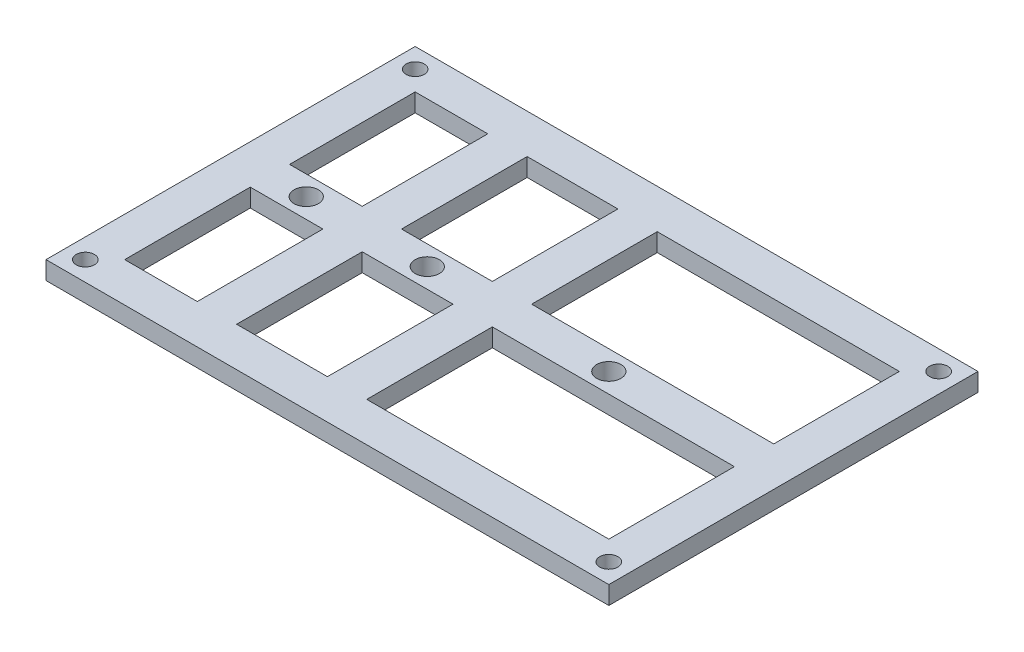
ISO-10303-21;
HEADER;
FILE_DESCRIPTION(('STEP AP214'),'2;1');
FILE_NAME('part.step','',(''),(''),'','','');
FILE_SCHEMA(('AUTOMOTIVE_DESIGN { 1 0 10303 214 1 1 1 1 }'));
ENDSEC;
DATA;
#1=APPLICATION_CONTEXT('core data for automotive mechanical design processes');
#2=APPLICATION_PROTOCOL_DEFINITION('international standard','automotive_design',2000,#1);
#3=PRODUCT_CONTEXT('',#1,'mechanical');
#4=PRODUCT('Part','Part','',(#3));
#5=PRODUCT_RELATED_PRODUCT_CATEGORY('part','',(#4));
#6=PRODUCT_DEFINITION_FORMATION('','',#4);
#7=PRODUCT_DEFINITION_CONTEXT('part definition',#1,'design');
#8=PRODUCT_DEFINITION('design','',#6,#7);
#9=PRODUCT_DEFINITION_SHAPE('','',#8);
#10=(LENGTH_UNIT() NAMED_UNIT(*) SI_UNIT(.MILLI.,.METRE.));
#11=(NAMED_UNIT(*) PLANE_ANGLE_UNIT() SI_UNIT($,.RADIAN.));
#12=(NAMED_UNIT(*) SI_UNIT($,.STERADIAN.) SOLID_ANGLE_UNIT());
#13=UNCERTAINTY_MEASURE_WITH_UNIT(LENGTH_MEASURE(1.E-05),#10,'distance_accuracy_value','');
#14=(GEOMETRIC_REPRESENTATION_CONTEXT(3) GLOBAL_UNCERTAINTY_ASSIGNED_CONTEXT((#13)) GLOBAL_UNIT_ASSIGNED_CONTEXT((#10,
#11,#12)) REPRESENTATION_CONTEXT('',''));
#15=CARTESIAN_POINT('',(0.,0.,0.));
#16=DIRECTION('',(0.,0.,1.));
#17=DIRECTION('',(1.,0.,0.));
#18=AXIS2_PLACEMENT_3D('',#15,#16,#17);
#19=CARTESIAN_POINT('',(0.,1.5,0.));
#20=DIRECTION('',(0.,1.,0.));
#21=DIRECTION('',(0.,0.,1.));
#22=AXIS2_PLACEMENT_3D('',#19,#20,#21);
#23=PLANE('',#22);
#24=CARTESIAN_POINT('',(43.25,1.5,-27.25));
#25=DIRECTION('',(0.,1.,0.));
#26=DIRECTION('',(0.,0.,-1.));
#27=AXIS2_PLACEMENT_3D('',#24,#25,#26);
#28=CIRCLE('',#27,1.5);
#29=CARTESIAN_POINT('',(43.25,1.5,-28.75));
#30=VERTEX_POINT('',#29);
#31=EDGE_CURVE('E717',#30,#30,#28,.T.);
#32=ORIENTED_EDGE('',*,*,#31,.F.);
#33=EDGE_LOOP('',(#32));
#34=FACE_BOUND('',#33,.T.);
#35=CARTESIAN_POINT('',(43.25,1.5,27.25));
#36=DIRECTION('',(0.,1.,0.));
#37=DIRECTION('',(0.,0.,1.));
#38=AXIS2_PLACEMENT_3D('',#35,#36,#37);
#39=CIRCLE('',#38,1.5);
#40=CARTESIAN_POINT('',(43.25,1.5,28.75));
#41=VERTEX_POINT('',#40);
#42=EDGE_CURVE('E733',#41,#41,#39,.T.);
#43=ORIENTED_EDGE('',*,*,#42,.F.);
#44=EDGE_LOOP('',(#43));
#45=FACE_BOUND('',#44,.T.);
#46=CARTESIAN_POINT('',(-14.,1.5,0.));
#47=DIRECTION('',(0.,1.,0.));
#48=DIRECTION('',(0.,0.,1.));
#49=AXIS2_PLACEMENT_3D('',#46,#47,#48);
#50=CIRCLE('',#49,2.);
#51=CARTESIAN_POINT('',(-14.,1.5,2.));
#52=VERTEX_POINT('',#51);
#53=EDGE_CURVE('E749',#52,#52,#50,.T.);
#54=ORIENTED_EDGE('',*,*,#53,.F.);
#55=EDGE_LOOP('',(#54));
#56=FACE_BOUND('',#55,.T.);
#57=DIRECTION('',(0.,0.,-1.));
#58=VECTOR('',#57,1.);
#59=CARTESIAN_POINT('',(-6.5,1.5,3.25));
#60=LINE('',#59,#58);
#61=CARTESIAN_POINT('',(-6.49999999999999,1.5,24.));
#62=VERTEX_POINT('',#61);
#63=CARTESIAN_POINT('',(-6.5,1.5,3.25));
#64=VERTEX_POINT('',#63);
#65=EDGE_CURVE('E234',#62,#64,#60,.T.);
#66=ORIENTED_EDGE('',*,*,#65,.F.);
#67=DIRECTION('',(1.,0.,0.));
#68=VECTOR('',#67,1.);
#69=CARTESIAN_POINT('',(-21.5,1.5,24.));
#70=LINE('',#69,#68);
#71=CARTESIAN_POINT('',(-21.5,1.5,24.));
#72=VERTEX_POINT('',#71);
#73=EDGE_CURVE('E225',#72,#62,#70,.T.);
#74=ORIENTED_EDGE('',*,*,#73,.F.);
#75=DIRECTION('',(0.,0.,1.));
#76=VECTOR('',#75,1.);
#77=CARTESIAN_POINT('',(-21.5,1.5,3.25));
#78=LINE('',#77,#76);
#79=CARTESIAN_POINT('',(-21.5,1.5,3.25));
#80=VERTEX_POINT('',#79);
#81=EDGE_CURVE('E252',#80,#72,#78,.T.);
#82=ORIENTED_EDGE('',*,*,#81,.F.);
#83=DIRECTION('',(-1.,0.,0.));
#84=VECTOR('',#83,1.);
#85=CARTESIAN_POINT('',(-21.5,1.5,3.25));
#86=LINE('',#85,#84);
#87=EDGE_CURVE('E248',#64,#80,#86,.T.);
#88=ORIENTED_EDGE('',*,*,#87,.F.);
#89=EDGE_LOOP('',(#66,#74,#82,#88));
#90=FACE_BOUND('',#89,.T.);
#91=DIRECTION('',(0.,0.,1.));
#92=VECTOR('',#91,1.);
#93=CARTESIAN_POINT('',(-21.5,1.5,-24.));
#94=LINE('',#93,#92);
#95=CARTESIAN_POINT('',(-21.5,1.5,-24.));
#96=VERTEX_POINT('',#95);
#97=CARTESIAN_POINT('',(-21.5,1.5,-3.24999999999999));
#98=VERTEX_POINT('',#97);
#99=EDGE_CURVE('E279',#96,#98,#94,.T.);
#100=ORIENTED_EDGE('',*,*,#99,.F.);
#101=DIRECTION('',(-1.,0.,0.));
#102=VECTOR('',#101,1.);
#103=CARTESIAN_POINT('',(-21.5,1.5,-24.));
#104=LINE('',#103,#102);
#105=CARTESIAN_POINT('',(-6.5,1.5,-24.));
#106=VERTEX_POINT('',#105);
#107=EDGE_CURVE('E276',#106,#96,#104,.T.);
#108=ORIENTED_EDGE('',*,*,#107,.F.);
#109=DIRECTION('',(0.,0.,-1.));
#110=VECTOR('',#109,1.);
#111=CARTESIAN_POINT('',(-6.5,1.5,-24.));
#112=LINE('',#111,#110);
#113=CARTESIAN_POINT('',(-6.5,1.5,-3.24999999999999));
#114=VERTEX_POINT('',#113);
#115=EDGE_CURVE('E287',#114,#106,#112,.T.);
#116=ORIENTED_EDGE('',*,*,#115,.F.);
#117=DIRECTION('',(1.,0.,0.));
#118=VECTOR('',#117,1.);
#119=CARTESIAN_POINT('',(-21.5,1.5,-3.24999999999999));
#120=LINE('',#119,#118);
#121=EDGE_CURVE('E283',#98,#114,#120,.T.);
#122=ORIENTED_EDGE('',*,*,#121,.F.);
#123=EDGE_LOOP('',(#100,#108,#116,#122));
#124=FACE_BOUND('',#123,.T.);
#125=DIRECTION('',(0.,0.,-1.));
#126=VECTOR('',#125,1.);
#127=CARTESIAN_POINT('',(40.,1.5,24.));
#128=LINE('',#127,#126);
#129=CARTESIAN_POINT('',(40.,1.5,24.));
#130=VERTEX_POINT('',#129);
#131=CARTESIAN_POINT('',(40.,1.5,3.24999999999999));
#132=VERTEX_POINT('',#131);
#133=EDGE_CURVE('E322',#130,#132,#128,.T.);
#134=ORIENTED_EDGE('',*,*,#133,.F.);
#135=DIRECTION('',(1.,0.,0.));
#136=VECTOR('',#135,1.);
#137=CARTESIAN_POINT('',(0.,1.5,24.));
#138=LINE('',#137,#136);
#139=CARTESIAN_POINT('',(0.,1.5,24.));
#140=VERTEX_POINT('',#139);
#141=EDGE_CURVE('E319',#140,#130,#138,.T.);
#142=ORIENTED_EDGE('',*,*,#141,.F.);
#143=DIRECTION('',(0.,0.,1.));
#144=VECTOR('',#143,1.);
#145=CARTESIAN_POINT('',(0.,1.5,3.25));
#146=LINE('',#145,#144);
#147=CARTESIAN_POINT('',(0.,1.5,3.25));
#148=VERTEX_POINT('',#147);
#149=EDGE_CURVE('E330',#148,#140,#146,.T.);
#150=ORIENTED_EDGE('',*,*,#149,.F.);
#151=DIRECTION('',(-1.,0.,0.));
#152=VECTOR('',#151,1.);
#153=CARTESIAN_POINT('',(0.,1.5,3.25));
#154=LINE('',#153,#152);
#155=EDGE_CURVE('E326',#132,#148,#154,.T.);
#156=ORIENTED_EDGE('',*,*,#155,.F.);
#157=EDGE_LOOP('',(#134,#142,#150,#156));
#158=FACE_BOUND('',#157,.T.);
#159=DIRECTION('',(1.,0.,0.));
#160=VECTOR('',#159,1.);
#161=CARTESIAN_POINT('',(-40.,1.5,-3.24999999999999));
#162=LINE('',#161,#160);
#163=CARTESIAN_POINT('',(-40.,1.5,-3.24999999999999));
#164=VERTEX_POINT('',#163);
#165=CARTESIAN_POINT('',(-28.,1.5,-3.24999999999999));
#166=VERTEX_POINT('',#165);
#167=EDGE_CURVE('E365',#164,#166,#162,.T.);
#168=ORIENTED_EDGE('',*,*,#167,.F.);
#169=DIRECTION('',(0.,0.,1.));
#170=VECTOR('',#169,1.);
#171=CARTESIAN_POINT('',(-40.,1.5,-3.24999999999999));
#172=LINE('',#171,#170);
#173=CARTESIAN_POINT('',(-40.,1.5,-24.));
#174=VERTEX_POINT('',#173);
#175=EDGE_CURVE('E362',#174,#164,#172,.T.);
#176=ORIENTED_EDGE('',*,*,#175,.F.);
#177=DIRECTION('',(-1.,0.,0.));
#178=VECTOR('',#177,1.);
#179=CARTESIAN_POINT('',(-40.,1.5,-24.));
#180=LINE('',#179,#178);
#181=CARTESIAN_POINT('',(-28.,1.5,-24.));
#182=VERTEX_POINT('',#181);
#183=EDGE_CURVE('E373',#182,#174,#180,.T.);
#184=ORIENTED_EDGE('',*,*,#183,.F.);
#185=DIRECTION('',(0.,0.,-1.));
#186=VECTOR('',#185,1.);
#187=CARTESIAN_POINT('',(-28.,1.5,-24.));
#188=LINE('',#187,#186);
#189=EDGE_CURVE('E369',#166,#182,#188,.T.);
#190=ORIENTED_EDGE('',*,*,#189,.F.);
#191=EDGE_LOOP('',(#168,#176,#184,#190));
#192=FACE_BOUND('',#191,.T.);
#193=DIRECTION('',(1.,0.,0.));
#194=VECTOR('',#193,1.);
#195=CARTESIAN_POINT('',(-40.,1.5,24.));
#196=LINE('',#195,#194);
#197=CARTESIAN_POINT('',(-40.,1.5,24.));
#198=VERTEX_POINT('',#197);
#199=CARTESIAN_POINT('',(-28.,1.5,24.));
#200=VERTEX_POINT('',#199);
#201=EDGE_CURVE('E408',#198,#200,#196,.T.);
#202=ORIENTED_EDGE('',*,*,#201,.F.);
#203=DIRECTION('',(0.,0.,1.));
#204=VECTOR('',#203,1.);
#205=CARTESIAN_POINT('',(-40.,1.5,24.));
#206=LINE('',#205,#204);
#207=CARTESIAN_POINT('',(-40.,1.5,3.25000000000001));
#208=VERTEX_POINT('',#207);
#209=EDGE_CURVE('E405',#208,#198,#206,.T.);
#210=ORIENTED_EDGE('',*,*,#209,.F.);
#211=DIRECTION('',(-1.,0.,0.));
#212=VECTOR('',#211,1.);
#213=CARTESIAN_POINT('',(-40.,1.5,3.25000000000001));
#214=LINE('',#213,#212);
#215=CARTESIAN_POINT('',(-28.,1.5,3.25));
#216=VERTEX_POINT('',#215);
#217=EDGE_CURVE('E416',#216,#208,#214,.T.);
#218=ORIENTED_EDGE('',*,*,#217,.F.);
#219=DIRECTION('',(0.,0.,-1.));
#220=VECTOR('',#219,1.);
#221=CARTESIAN_POINT('',(-28.,1.5,3.25));
#222=LINE('',#221,#220);
#223=EDGE_CURVE('E412',#200,#216,#222,.T.);
#224=ORIENTED_EDGE('',*,*,#223,.F.);
#225=EDGE_LOOP('',(#202,#210,#218,#224));
#226=FACE_BOUND('',#225,.T.);
#227=DIRECTION('',(-1.,0.,0.));
#228=VECTOR('',#227,1.);
#229=CARTESIAN_POINT('',(0.,1.5,-24.));
#230=LINE('',#229,#228);
#231=CARTESIAN_POINT('',(40.,1.5,-24.));
#232=VERTEX_POINT('',#231);
#233=CARTESIAN_POINT('',(0.,1.5,-24.));
#234=VERTEX_POINT('',#233);
#235=EDGE_CURVE('E451',#232,#234,#230,.T.);
#236=ORIENTED_EDGE('',*,*,#235,.F.);
#237=DIRECTION('',(0.,0.,-1.));
#238=VECTOR('',#237,1.);
#239=CARTESIAN_POINT('',(40.,1.5,-3.24999999999999));
#240=LINE('',#239,#238);
#241=CARTESIAN_POINT('',(40.,1.5,-3.24999999999999));
#242=VERTEX_POINT('',#241);
#243=EDGE_CURVE('E448',#242,#232,#240,.T.);
#244=ORIENTED_EDGE('',*,*,#243,.F.);
#245=DIRECTION('',(1.,0.,0.));
#246=VECTOR('',#245,1.);
#247=CARTESIAN_POINT('',(0.,1.5,-3.24999999999999));
#248=LINE('',#247,#246);
#249=CARTESIAN_POINT('',(0.,1.5,-3.24999999999999));
#250=VERTEX_POINT('',#249);
#251=EDGE_CURVE('E459',#250,#242,#248,.T.);
#252=ORIENTED_EDGE('',*,*,#251,.F.);
#253=DIRECTION('',(0.,0.,1.));
#254=VECTOR('',#253,1.);
#255=CARTESIAN_POINT('',(0.,1.5,-24.));
#256=LINE('',#255,#254);
#257=EDGE_CURVE('E455',#234,#250,#256,.T.);
#258=ORIENTED_EDGE('',*,*,#257,.F.);
#259=EDGE_LOOP('',(#236,#244,#252,#258));
#260=FACE_BOUND('',#259,.T.);
#261=DIRECTION('',(1.,0.,0.));
#262=VECTOR('',#261,1.);
#263=CARTESIAN_POINT('',(-46.5,1.5,30.5));
#264=LINE('',#263,#262);
#265=CARTESIAN_POINT('',(-46.5,1.5,30.5));
#266=VERTEX_POINT('',#265);
#267=CARTESIAN_POINT('',(46.5,1.5,30.5));
#268=VERTEX_POINT('',#267);
#269=EDGE_CURVE('E491',#266,#268,#264,.T.);
#270=ORIENTED_EDGE('',*,*,#269,.T.);
#271=DIRECTION('',(0.,0.,-1.));
#272=VECTOR('',#271,1.);
#273=CARTESIAN_POINT('',(46.5,1.5,30.5));
#274=LINE('',#273,#272);
#275=CARTESIAN_POINT('',(46.5,1.5,-30.5));
#276=VERTEX_POINT('',#275);
#277=EDGE_CURVE('E495',#268,#276,#274,.T.);
#278=ORIENTED_EDGE('',*,*,#277,.T.);
#279=DIRECTION('',(-1.,0.,0.));
#280=VECTOR('',#279,1.);
#281=CARTESIAN_POINT('',(-46.5,1.5,-30.5));
#282=LINE('',#281,#280);
#283=CARTESIAN_POINT('',(-46.5,1.5,-30.5));
#284=VERTEX_POINT('',#283);
#285=EDGE_CURVE('E499',#276,#284,#282,.T.);
#286=ORIENTED_EDGE('',*,*,#285,.T.);
#287=DIRECTION('',(0.,0.,1.));
#288=VECTOR('',#287,1.);
#289=CARTESIAN_POINT('',(-46.5,1.5,30.5));
#290=LINE('',#289,#288);
#291=EDGE_CURVE('E502',#284,#266,#290,.T.);
#292=ORIENTED_EDGE('',*,*,#291,.T.);
#293=EDGE_LOOP('',(#270,#278,#286,#292));
#294=FACE_BOUND('',#293,.T.);
#295=CARTESIAN_POINT('',(-34.,1.5,0.));
#296=DIRECTION('',(0.,1.,0.));
#297=DIRECTION('',(0.,0.,1.));
#298=AXIS2_PLACEMENT_3D('',#295,#296,#297);
#299=CIRCLE('',#298,2.);
#300=CARTESIAN_POINT('',(-34.,1.5,2.00000000000001));
#301=VERTEX_POINT('',#300);
#302=EDGE_CURVE('E260',#301,#301,#299,.T.);
#303=ORIENTED_EDGE('',*,*,#302,.F.);
#304=EDGE_LOOP('',(#303));
#305=FACE_BOUND('',#304,.T.);
#306=CARTESIAN_POINT('',(16.,1.5,0.));
#307=DIRECTION('',(0.,1.,0.));
#308=DIRECTION('',(0.,0.,1.));
#309=AXIS2_PLACEMENT_3D('',#306,#307,#308);
#310=CIRCLE('',#309,2.);
#311=CARTESIAN_POINT('',(16.,1.5,2.));
#312=VERTEX_POINT('',#311);
#313=EDGE_CURVE('E741',#312,#312,#310,.T.);
#314=ORIENTED_EDGE('',*,*,#313,.F.);
#315=EDGE_LOOP('',(#314));
#316=FACE_BOUND('',#315,.T.);
#317=CARTESIAN_POINT('',(-43.25,1.5,27.25));
#318=DIRECTION('',(0.,1.,0.));
#319=DIRECTION('',(0.,0.,1.));
#320=AXIS2_PLACEMENT_3D('',#317,#318,#319);
#321=CIRCLE('',#320,1.5);
#322=CARTESIAN_POINT('',(-43.25,1.5,28.75));
#323=VERTEX_POINT('',#322);
#324=EDGE_CURVE('E725',#323,#323,#321,.T.);
#325=ORIENTED_EDGE('',*,*,#324,.F.);
#326=EDGE_LOOP('',(#325));
#327=FACE_BOUND('',#326,.T.);
#328=CARTESIAN_POINT('',(-43.25,1.5,-27.25));
#329=DIRECTION('',(0.,1.,0.));
#330=DIRECTION('',(0.,0.,-1.));
#331=AXIS2_PLACEMENT_3D('',#328,#329,#330);
#332=CIRCLE('',#331,1.5);
#333=CARTESIAN_POINT('',(-43.25,1.5,-28.75));
#334=VERTEX_POINT('',#333);
#335=EDGE_CURVE('E706',#334,#334,#332,.T.);
#336=ORIENTED_EDGE('',*,*,#335,.F.);
#337=EDGE_LOOP('',(#336));
#338=FACE_BOUND('',#337,.T.);
#339=ADVANCED_FACE('F39',(#34,#45,#56,#90,#124,#158,#192,#226,#260,#294,#305,#316,#327,#338),
#23,.T.);
#340=CARTESIAN_POINT('',(0.,-1.5,0.));
#341=DIRECTION('',(0.,1.,0.));
#342=DIRECTION('',(0.,0.,1.));
#343=AXIS2_PLACEMENT_3D('',#340,#341,#342);
#344=PLANE('',#343);
#345=DIRECTION('',(-1.,0.,0.));
#346=VECTOR('',#345,1.);
#347=CARTESIAN_POINT('',(-21.5,-1.5,-24.));
#348=LINE('',#347,#346);
#349=CARTESIAN_POINT('',(-6.5,-1.5,-24.));
#350=VERTEX_POINT('',#349);
#351=CARTESIAN_POINT('',(-21.5,-1.5,-24.));
#352=VERTEX_POINT('',#351);
#353=EDGE_CURVE('E243',#350,#352,#348,.T.);
#354=ORIENTED_EDGE('',*,*,#353,.T.);
#355=DIRECTION('',(0.,0.,1.));
#356=VECTOR('',#355,1.);
#357=CARTESIAN_POINT('',(-21.5,-1.5,-24.));
#358=LINE('',#357,#356);
#359=CARTESIAN_POINT('',(-21.5,-1.5,-3.24999999999999));
#360=VERTEX_POINT('',#359);
#361=EDGE_CURVE('E294',#352,#360,#358,.T.);
#362=ORIENTED_EDGE('',*,*,#361,.T.);
#363=DIRECTION('',(1.,0.,0.));
#364=VECTOR('',#363,1.);
#365=CARTESIAN_POINT('',(-21.5,-1.5,-3.24999999999999));
#366=LINE('',#365,#364);
#367=CARTESIAN_POINT('',(-6.5,-1.5,-3.24999999999999));
#368=VERTEX_POINT('',#367);
#369=EDGE_CURVE('E298',#360,#368,#366,.T.);
#370=ORIENTED_EDGE('',*,*,#369,.T.);
#371=DIRECTION('',(0.,0.,-1.));
#372=VECTOR('',#371,1.);
#373=CARTESIAN_POINT('',(-6.5,-1.5,-24.));
#374=LINE('',#373,#372);
#375=EDGE_CURVE('E280',#368,#350,#374,.T.);
#376=ORIENTED_EDGE('',*,*,#375,.T.);
#377=EDGE_LOOP('',(#354,#362,#370,#376));
#378=FACE_BOUND('',#377,.T.);
#379=DIRECTION('',(0.,0.,1.));
#380=VECTOR('',#379,1.);
#381=CARTESIAN_POINT('',(-40.,-1.5,-3.24999999999999));
#382=LINE('',#381,#380);
#383=CARTESIAN_POINT('',(-40.,-1.5,-24.));
#384=VERTEX_POINT('',#383);
#385=CARTESIAN_POINT('',(-40.,-1.5,-3.24999999999999));
#386=VERTEX_POINT('',#385);
#387=EDGE_CURVE('E361',#384,#386,#382,.T.);
#388=ORIENTED_EDGE('',*,*,#387,.T.);
#389=DIRECTION('',(1.,0.,0.));
#390=VECTOR('',#389,1.);
#391=CARTESIAN_POINT('',(-40.,-1.5,-3.24999999999999));
#392=LINE('',#391,#390);
#393=CARTESIAN_POINT('',(-28.,-1.5,-3.24999999999999));
#394=VERTEX_POINT('',#393);
#395=EDGE_CURVE('E380',#386,#394,#392,.T.);
#396=ORIENTED_EDGE('',*,*,#395,.T.);
#397=DIRECTION('',(0.,0.,-1.));
#398=VECTOR('',#397,1.);
#399=CARTESIAN_POINT('',(-28.,-1.5,-24.));
#400=LINE('',#399,#398);
#401=CARTESIAN_POINT('',(-28.,-1.5,-24.));
#402=VERTEX_POINT('',#401);
#403=EDGE_CURVE('E384',#394,#402,#400,.T.);
#404=ORIENTED_EDGE('',*,*,#403,.T.);
#405=DIRECTION('',(-1.,0.,0.));
#406=VECTOR('',#405,1.);
#407=CARTESIAN_POINT('',(-40.,-1.5,-24.));
#408=LINE('',#407,#406);
#409=EDGE_CURVE('E366',#402,#384,#408,.T.);
#410=ORIENTED_EDGE('',*,*,#409,.T.);
#411=EDGE_LOOP('',(#388,#396,#404,#410));
#412=FACE_BOUND('',#411,.T.);
#413=DIRECTION('',(0.,0.,-1.));
#414=VECTOR('',#413,1.);
#415=CARTESIAN_POINT('',(40.,-1.5,-3.24999999999999));
#416=LINE('',#415,#414);
#417=CARTESIAN_POINT('',(40.,-1.5,-3.24999999999999));
#418=VERTEX_POINT('',#417);
#419=CARTESIAN_POINT('',(40.,-1.5,-24.));
#420=VERTEX_POINT('',#419);
#421=EDGE_CURVE('E447',#418,#420,#416,.T.);
#422=ORIENTED_EDGE('',*,*,#421,.T.);
#423=DIRECTION('',(-1.,0.,0.));
#424=VECTOR('',#423,1.);
#425=CARTESIAN_POINT('',(0.,-1.5,-24.));
#426=LINE('',#425,#424);
#427=CARTESIAN_POINT('',(0.,-1.5,-24.));
#428=VERTEX_POINT('',#427);
#429=EDGE_CURVE('E466',#420,#428,#426,.T.);
#430=ORIENTED_EDGE('',*,*,#429,.T.);
#431=DIRECTION('',(0.,0.,1.));
#432=VECTOR('',#431,1.);
#433=CARTESIAN_POINT('',(0.,-1.5,-24.));
#434=LINE('',#433,#432);
#435=CARTESIAN_POINT('',(0.,-1.5,-3.24999999999999));
#436=VERTEX_POINT('',#435);
#437=EDGE_CURVE('E470',#428,#436,#434,.T.);
#438=ORIENTED_EDGE('',*,*,#437,.T.);
#439=DIRECTION('',(1.,0.,0.));
#440=VECTOR('',#439,1.);
#441=CARTESIAN_POINT('',(0.,-1.5,-3.24999999999999));
#442=LINE('',#441,#440);
#443=EDGE_CURVE('E452',#436,#418,#442,.T.);
#444=ORIENTED_EDGE('',*,*,#443,.T.);
#445=EDGE_LOOP('',(#422,#430,#438,#444));
#446=FACE_BOUND('',#445,.T.);
#447=DIRECTION('',(1.,0.,0.));
#448=VECTOR('',#447,1.);
#449=CARTESIAN_POINT('',(-46.5,-1.5,30.5));
#450=LINE('',#449,#448);
#451=CARTESIAN_POINT('',(-46.5,-1.5,30.5));
#452=VERTEX_POINT('',#451);
#453=CARTESIAN_POINT('',(46.5,-1.5,30.5));
#454=VERTEX_POINT('',#453);
#455=EDGE_CURVE('E490',#452,#454,#450,.T.);
#456=ORIENTED_EDGE('',*,*,#455,.F.);
#457=DIRECTION('',(0.,0.,1.));
#458=VECTOR('',#457,1.);
#459=CARTESIAN_POINT('',(-46.5,-1.5,30.5));
#460=LINE('',#459,#458);
#461=CARTESIAN_POINT('',(-46.5,-1.5,-30.5));
#462=VERTEX_POINT('',#461);
#463=EDGE_CURVE('E496',#462,#452,#460,.T.);
#464=ORIENTED_EDGE('',*,*,#463,.F.);
#465=DIRECTION('',(-1.,0.,0.));
#466=VECTOR('',#465,1.);
#467=CARTESIAN_POINT('',(-46.5,-1.5,-30.5));
#468=LINE('',#467,#466);
#469=CARTESIAN_POINT('',(46.5,-1.5,-30.5));
#470=VERTEX_POINT('',#469);
#471=EDGE_CURVE('E512',#470,#462,#468,.T.);
#472=ORIENTED_EDGE('',*,*,#471,.F.);
#473=DIRECTION('',(0.,0.,-1.));
#474=VECTOR('',#473,1.);
#475=CARTESIAN_POINT('',(46.5,-1.5,30.5));
#476=LINE('',#475,#474);
#477=EDGE_CURVE('E509',#454,#470,#476,.T.);
#478=ORIENTED_EDGE('',*,*,#477,.F.);
#479=EDGE_LOOP('',(#456,#464,#472,#478));
#480=FACE_BOUND('',#479,.T.);
#481=DIRECTION('',(0.,0.,1.));
#482=VECTOR('',#481,1.);
#483=CARTESIAN_POINT('',(-40.,-1.5,24.));
#484=LINE('',#483,#482);
#485=CARTESIAN_POINT('',(-40.,-1.5,3.25000000000001));
#486=VERTEX_POINT('',#485);
#487=CARTESIAN_POINT('',(-40.,-1.5,24.));
#488=VERTEX_POINT('',#487);
#489=EDGE_CURVE('E404',#486,#488,#484,.T.);
#490=ORIENTED_EDGE('',*,*,#489,.T.);
#491=DIRECTION('',(1.,0.,0.));
#492=VECTOR('',#491,1.);
#493=CARTESIAN_POINT('',(-40.,-1.5,24.));
#494=LINE('',#493,#492);
#495=CARTESIAN_POINT('',(-28.,-1.5,24.));
#496=VERTEX_POINT('',#495);
#497=EDGE_CURVE('E423',#488,#496,#494,.T.);
#498=ORIENTED_EDGE('',*,*,#497,.T.);
#499=DIRECTION('',(0.,0.,-1.));
#500=VECTOR('',#499,1.);
#501=CARTESIAN_POINT('',(-28.,-1.5,3.25));
#502=LINE('',#501,#500);
#503=CARTESIAN_POINT('',(-28.,-1.5,3.25));
#504=VERTEX_POINT('',#503);
#505=EDGE_CURVE('E427',#496,#504,#502,.T.);
#506=ORIENTED_EDGE('',*,*,#505,.T.);
#507=DIRECTION('',(-1.,0.,0.));
#508=VECTOR('',#507,1.);
#509=CARTESIAN_POINT('',(-40.,-1.5,3.25000000000001));
#510=LINE('',#509,#508);
#511=EDGE_CURVE('E409',#504,#486,#510,.T.);
#512=ORIENTED_EDGE('',*,*,#511,.T.);
#513=EDGE_LOOP('',(#490,#498,#506,#512));
#514=FACE_BOUND('',#513,.T.);
#515=DIRECTION('',(1.,0.,0.));
#516=VECTOR('',#515,1.);
#517=CARTESIAN_POINT('',(0.,-1.5,24.));
#518=LINE('',#517,#516);
#519=CARTESIAN_POINT('',(0.,-1.5,24.));
#520=VERTEX_POINT('',#519);
#521=CARTESIAN_POINT('',(40.,-1.5,24.));
#522=VERTEX_POINT('',#521);
#523=EDGE_CURVE('E318',#520,#522,#518,.T.);
#524=ORIENTED_EDGE('',*,*,#523,.T.);
#525=DIRECTION('',(0.,0.,-1.));
#526=VECTOR('',#525,1.);
#527=CARTESIAN_POINT('',(40.,-1.5,24.));
#528=LINE('',#527,#526);
#529=CARTESIAN_POINT('',(40.,-1.5,3.24999999999999));
#530=VERTEX_POINT('',#529);
#531=EDGE_CURVE('E337',#522,#530,#528,.T.);
#532=ORIENTED_EDGE('',*,*,#531,.T.);
#533=DIRECTION('',(-1.,0.,0.));
#534=VECTOR('',#533,1.);
#535=CARTESIAN_POINT('',(0.,-1.5,3.25));
#536=LINE('',#535,#534);
#537=CARTESIAN_POINT('',(0.,-1.5,3.25));
#538=VERTEX_POINT('',#537);
#539=EDGE_CURVE('E341',#530,#538,#536,.T.);
#540=ORIENTED_EDGE('',*,*,#539,.T.);
#541=DIRECTION('',(0.,0.,1.));
#542=VECTOR('',#541,1.);
#543=CARTESIAN_POINT('',(0.,-1.5,3.25));
#544=LINE('',#543,#542);
#545=EDGE_CURVE('E323',#538,#520,#544,.T.);
#546=ORIENTED_EDGE('',*,*,#545,.T.);
#547=EDGE_LOOP('',(#524,#532,#540,#546));
#548=FACE_BOUND('',#547,.T.);
#549=DIRECTION('',(1.,0.,0.));
#550=VECTOR('',#549,1.);
#551=CARTESIAN_POINT('',(-21.5,-1.5,24.));
#552=LINE('',#551,#550);
#553=CARTESIAN_POINT('',(-21.5,-1.5,24.));
#554=VERTEX_POINT('',#553);
#555=CARTESIAN_POINT('',(-6.49999999999999,-1.5,24.));
#556=VERTEX_POINT('',#555);
#557=EDGE_CURVE('E63',#554,#556,#552,.T.);
#558=ORIENTED_EDGE('',*,*,#557,.T.);
#559=DIRECTION('',(0.,0.,-1.));
#560=VECTOR('',#559,1.);
#561=CARTESIAN_POINT('',(-6.5,-1.5,3.25));
#562=LINE('',#561,#560);
#563=CARTESIAN_POINT('',(-6.5,-1.5,3.25));
#564=VERTEX_POINT('',#563);
#565=EDGE_CURVE('E241',#556,#564,#562,.T.);
#566=ORIENTED_EDGE('',*,*,#565,.T.);
#567=DIRECTION('',(-1.,0.,0.));
#568=VECTOR('',#567,1.);
#569=CARTESIAN_POINT('',(-21.5,-1.5,3.25));
#570=LINE('',#569,#568);
#571=CARTESIAN_POINT('',(-21.5,-1.5,3.25));
#572=VERTEX_POINT('',#571);
#573=EDGE_CURVE('E263',#564,#572,#570,.T.);
#574=ORIENTED_EDGE('',*,*,#573,.T.);
#575=DIRECTION('',(0.,0.,1.));
#576=VECTOR('',#575,1.);
#577=CARTESIAN_POINT('',(-21.5,-1.5,3.25));
#578=LINE('',#577,#576);
#579=EDGE_CURVE('E235',#572,#554,#578,.T.);
#580=ORIENTED_EDGE('',*,*,#579,.T.);
#581=EDGE_LOOP('',(#558,#566,#574,#580));
#582=FACE_BOUND('',#581,.T.);
#583=CARTESIAN_POINT('',(-34.,-1.5,0.));
#584=DIRECTION('',(0.,1.,0.));
#585=DIRECTION('',(0.,0.,1.));
#586=AXIS2_PLACEMENT_3D('',#583,#584,#585);
#587=CIRCLE('',#586,2.);
#588=CARTESIAN_POINT('',(-34.,-1.5,2.00000000000001));
#589=VERTEX_POINT('',#588);
#590=EDGE_CURVE('E753',#589,#589,#587,.T.);
#591=ORIENTED_EDGE('',*,*,#590,.T.);
#592=EDGE_LOOP('',(#591));
#593=FACE_BOUND('',#592,.T.);
#594=CARTESIAN_POINT('',(-14.,-1.5,0.));
#595=DIRECTION('',(0.,1.,0.));
#596=DIRECTION('',(0.,0.,1.));
#597=AXIS2_PLACEMENT_3D('',#594,#595,#596);
#598=CIRCLE('',#597,2.);
#599=CARTESIAN_POINT('',(-14.,-1.5,2.));
#600=VERTEX_POINT('',#599);
#601=EDGE_CURVE('E745',#600,#600,#598,.T.);
#602=ORIENTED_EDGE('',*,*,#601,.T.);
#603=EDGE_LOOP('',(#602));
#604=FACE_BOUND('',#603,.T.);
#605=CARTESIAN_POINT('',(16.,-1.5,0.));
#606=DIRECTION('',(0.,1.,0.));
#607=DIRECTION('',(0.,0.,1.));
#608=AXIS2_PLACEMENT_3D('',#605,#606,#607);
#609=CIRCLE('',#608,2.);
#610=CARTESIAN_POINT('',(16.,-1.5,2.));
#611=VERTEX_POINT('',#610);
#612=EDGE_CURVE('E737',#611,#611,#609,.T.);
#613=ORIENTED_EDGE('',*,*,#612,.T.);
#614=EDGE_LOOP('',(#613));
#615=FACE_BOUND('',#614,.T.);
#616=CARTESIAN_POINT('',(43.25,-1.5,27.25));
#617=DIRECTION('',(0.,1.,0.));
#618=DIRECTION('',(0.,0.,1.));
#619=AXIS2_PLACEMENT_3D('',#616,#617,#618);
#620=CIRCLE('',#619,1.5);
#621=CARTESIAN_POINT('',(43.25,-1.5,28.75));
#622=VERTEX_POINT('',#621);
#623=EDGE_CURVE('E729',#622,#622,#620,.T.);
#624=ORIENTED_EDGE('',*,*,#623,.T.);
#625=EDGE_LOOP('',(#624));
#626=FACE_BOUND('',#625,.T.);
#627=CARTESIAN_POINT('',(-43.25,-1.5,27.25));
#628=DIRECTION('',(0.,1.,0.));
#629=DIRECTION('',(0.,0.,1.));
#630=AXIS2_PLACEMENT_3D('',#627,#628,#629);
#631=CIRCLE('',#630,1.5);
#632=CARTESIAN_POINT('',(-43.25,-1.5,28.75));
#633=VERTEX_POINT('',#632);
#634=EDGE_CURVE('E721',#633,#633,#631,.T.);
#635=ORIENTED_EDGE('',*,*,#634,.T.);
#636=EDGE_LOOP('',(#635));
#637=FACE_BOUND('',#636,.T.);
#638=CARTESIAN_POINT('',(43.25,-1.5,-27.25));
#639=DIRECTION('',(0.,1.,0.));
#640=DIRECTION('',(0.,0.,-1.));
#641=AXIS2_PLACEMENT_3D('',#638,#639,#640);
#642=CIRCLE('',#641,1.5);
#643=CARTESIAN_POINT('',(43.25,-1.5,-28.75));
#644=VERTEX_POINT('',#643);
#645=EDGE_CURVE('E714',#644,#644,#642,.T.);
#646=ORIENTED_EDGE('',*,*,#645,.T.);
#647=EDGE_LOOP('',(#646));
#648=FACE_BOUND('',#647,.T.);
#649=CARTESIAN_POINT('',(-43.25,-1.5,-27.25));
#650=DIRECTION('',(0.,1.,0.));
#651=DIRECTION('',(0.,0.,-1.));
#652=AXIS2_PLACEMENT_3D('',#649,#650,#651);
#653=CIRCLE('',#652,1.5);
#654=CARTESIAN_POINT('',(-43.25,-1.5,-28.75));
#655=VERTEX_POINT('',#654);
#656=EDGE_CURVE('E709',#655,#655,#653,.T.);
#657=ORIENTED_EDGE('',*,*,#656,.T.);
#658=EDGE_LOOP('',(#657));
#659=FACE_BOUND('',#658,.T.);
#660=ADVANCED_FACE('F535',(#378,#412,#446,#480,#514,#548,#582,#593,#604,#615,#626,#637,#648,
#659),#344,.F.);
#661=CARTESIAN_POINT('',(-46.5,1.5,30.5));
#662=DIRECTION('',(0.,0.,-1.));
#663=DIRECTION('',(-1.,0.,0.));
#664=AXIS2_PLACEMENT_3D('',#661,#662,#663);
#665=PLANE('',#664);
#666=ORIENTED_EDGE('',*,*,#455,.T.);
#667=DIRECTION('',(0.,-1.,0.));
#668=VECTOR('',#667,1.);
#669=CARTESIAN_POINT('',(46.5,1.5,30.5));
#670=LINE('',#669,#668);
#671=EDGE_CURVE('E11',#268,#454,#670,.T.);
#672=ORIENTED_EDGE('',*,*,#671,.F.);
#673=ORIENTED_EDGE('',*,*,#269,.F.);
#674=DIRECTION('',(0.,-1.,0.));
#675=VECTOR('',#674,1.);
#676=CARTESIAN_POINT('',(-46.5,1.5,30.5));
#677=LINE('',#676,#675);
#678=EDGE_CURVE('E505',#266,#452,#677,.T.);
#679=ORIENTED_EDGE('',*,*,#678,.T.);
#680=EDGE_LOOP('',(#666,#672,#673,#679));
#681=FACE_BOUND('',#680,.T.);
#682=ADVANCED_FACE('F41',(#681),#665,.F.);
#683=CARTESIAN_POINT('',(46.5,1.5,30.5));
#684=DIRECTION('',(-1.,0.,0.));
#685=DIRECTION('',(0.,0.,1.));
#686=AXIS2_PLACEMENT_3D('',#683,#684,#685);
#687=PLANE('',#686);
#688=ORIENTED_EDGE('',*,*,#477,.T.);
#689=DIRECTION('',(0.,-1.,0.));
#690=VECTOR('',#689,1.);
#691=CARTESIAN_POINT('',(46.5,1.5,-30.5));
#692=LINE('',#691,#690);
#693=EDGE_CURVE('E48',#276,#470,#692,.T.);
#694=ORIENTED_EDGE('',*,*,#693,.F.);
#695=ORIENTED_EDGE('',*,*,#277,.F.);
#696=ORIENTED_EDGE('',*,*,#671,.T.);
#697=EDGE_LOOP('',(#688,#694,#695,#696));
#698=FACE_BOUND('',#697,.T.);
#699=ADVANCED_FACE('F546',(#698),#687,.F.);
#700=CARTESIAN_POINT('',(-46.5,1.5,-30.5));
#701=DIRECTION('',(0.,0.,1.));
#702=DIRECTION('',(1.,0.,0.));
#703=AXIS2_PLACEMENT_3D('',#700,#701,#702);
#704=PLANE('',#703);
#705=ORIENTED_EDGE('',*,*,#471,.T.);
#706=DIRECTION('',(0.,-1.,0.));
#707=VECTOR('',#706,1.);
#708=CARTESIAN_POINT('',(-46.5,1.5,-30.5));
#709=LINE('',#708,#707);
#710=EDGE_CURVE('E520',#284,#462,#709,.T.);
#711=ORIENTED_EDGE('',*,*,#710,.F.);
#712=ORIENTED_EDGE('',*,*,#285,.F.);
#713=ORIENTED_EDGE('',*,*,#693,.T.);
#714=EDGE_LOOP('',(#705,#711,#712,#713));
#715=FACE_BOUND('',#714,.T.);
#716=ADVANCED_FACE('F529',(#715),#704,.F.);
#717=CARTESIAN_POINT('',(-46.5,1.5,30.5));
#718=DIRECTION('',(1.,0.,0.));
#719=DIRECTION('',(0.,0.,-1.));
#720=AXIS2_PLACEMENT_3D('',#717,#718,#719);
#721=PLANE('',#720);
#722=ORIENTED_EDGE('',*,*,#463,.T.);
#723=ORIENTED_EDGE('',*,*,#678,.F.);
#724=ORIENTED_EDGE('',*,*,#291,.F.);
#725=ORIENTED_EDGE('',*,*,#710,.T.);
#726=EDGE_LOOP('',(#722,#723,#724,#725));
#727=FACE_BOUND('',#726,.T.);
#728=ADVANCED_FACE('F539',(#727),#721,.F.);
#729=CARTESIAN_POINT('',(40.,1.5,-3.24999999999999));
#730=DIRECTION('',(-1.,0.,0.));
#731=DIRECTION('',(0.,0.,1.));
#732=AXIS2_PLACEMENT_3D('',#729,#730,#731);
#733=PLANE('',#732);
#734=ORIENTED_EDGE('',*,*,#421,.F.);
#735=DIRECTION('',(0.,-1.,0.));
#736=VECTOR('',#735,1.);
#737=CARTESIAN_POINT('',(40.,1.5,-3.24999999999999));
#738=LINE('',#737,#736);
#739=EDGE_CURVE('E462',#242,#418,#738,.T.);
#740=ORIENTED_EDGE('',*,*,#739,.F.);
#741=ORIENTED_EDGE('',*,*,#243,.T.);
#742=DIRECTION('',(0.,-1.,0.));
#743=VECTOR('',#742,1.);
#744=CARTESIAN_POINT('',(40.,1.5,-24.));
#745=LINE('',#744,#743);
#746=EDGE_CURVE('E486',#232,#420,#745,.T.);
#747=ORIENTED_EDGE('',*,*,#746,.T.);
#748=EDGE_LOOP('',(#734,#740,#741,#747));
#749=FACE_BOUND('',#748,.T.);
#750=ADVANCED_FACE('F564',(#749),#733,.T.);
#751=CARTESIAN_POINT('',(0.,1.5,-24.));
#752=DIRECTION('',(0.,0.,1.));
#753=DIRECTION('',(1.,0.,0.));
#754=AXIS2_PLACEMENT_3D('',#751,#752,#753);
#755=PLANE('',#754);
#756=ORIENTED_EDGE('',*,*,#429,.F.);
#757=ORIENTED_EDGE('',*,*,#746,.F.);
#758=ORIENTED_EDGE('',*,*,#235,.T.);
#759=DIRECTION('',(0.,-1.,0.));
#760=VECTOR('',#759,1.);
#761=CARTESIAN_POINT('',(0.,1.5,-24.));
#762=LINE('',#761,#760);
#763=EDGE_CURVE('E483',#234,#428,#762,.T.);
#764=ORIENTED_EDGE('',*,*,#763,.T.);
#765=EDGE_LOOP('',(#756,#757,#758,#764));
#766=FACE_BOUND('',#765,.T.);
#767=ADVANCED_FACE('F571',(#766),#755,.T.);
#768=CARTESIAN_POINT('',(0.,1.5,-24.));
#769=DIRECTION('',(1.,0.,0.));
#770=DIRECTION('',(0.,0.,-1.));
#771=AXIS2_PLACEMENT_3D('',#768,#769,#770);
#772=PLANE('',#771);
#773=ORIENTED_EDGE('',*,*,#437,.F.);
#774=ORIENTED_EDGE('',*,*,#763,.F.);
#775=ORIENTED_EDGE('',*,*,#257,.T.);
#776=DIRECTION('',(0.,-1.,0.));
#777=VECTOR('',#776,1.);
#778=CARTESIAN_POINT('',(0.,1.5,-3.24999999999999));
#779=LINE('',#778,#777);
#780=EDGE_CURVE('E480',#250,#436,#779,.T.);
#781=ORIENTED_EDGE('',*,*,#780,.T.);
#782=EDGE_LOOP('',(#773,#774,#775,#781));
#783=FACE_BOUND('',#782,.T.);
#784=ADVANCED_FACE('F576',(#783),#772,.T.);
#785=CARTESIAN_POINT('',(0.,1.5,-3.24999999999999));
#786=DIRECTION('',(0.,0.,-1.));
#787=DIRECTION('',(-1.,0.,0.));
#788=AXIS2_PLACEMENT_3D('',#785,#786,#787);
#789=PLANE('',#788);
#790=ORIENTED_EDGE('',*,*,#443,.F.);
#791=ORIENTED_EDGE('',*,*,#780,.F.);
#792=ORIENTED_EDGE('',*,*,#251,.T.);
#793=ORIENTED_EDGE('',*,*,#739,.T.);
#794=EDGE_LOOP('',(#790,#791,#792,#793));
#795=FACE_BOUND('',#794,.T.);
#796=ADVANCED_FACE('F584',(#795),#789,.T.);
#797=CARTESIAN_POINT('',(-40.,1.5,24.));
#798=DIRECTION('',(1.,0.,0.));
#799=DIRECTION('',(0.,0.,-1.));
#800=AXIS2_PLACEMENT_3D('',#797,#798,#799);
#801=PLANE('',#800);
#802=ORIENTED_EDGE('',*,*,#489,.F.);
#803=DIRECTION('',(0.,-1.,0.));
#804=VECTOR('',#803,1.);
#805=CARTESIAN_POINT('',(-40.,1.5,3.25000000000001));
#806=LINE('',#805,#804);
#807=EDGE_CURVE('E419',#208,#486,#806,.T.);
#808=ORIENTED_EDGE('',*,*,#807,.F.);
#809=ORIENTED_EDGE('',*,*,#209,.T.);
#810=DIRECTION('',(0.,-1.,0.));
#811=VECTOR('',#810,1.);
#812=CARTESIAN_POINT('',(-40.,1.5,24.));
#813=LINE('',#812,#811);
#814=EDGE_CURVE('E443',#198,#488,#813,.T.);
#815=ORIENTED_EDGE('',*,*,#814,.T.);
#816=EDGE_LOOP('',(#802,#808,#809,#815));
#817=FACE_BOUND('',#816,.T.);
#818=ADVANCED_FACE('F597',(#817),#801,.T.);
#819=CARTESIAN_POINT('',(-40.,1.5,24.));
#820=DIRECTION('',(0.,0.,-1.));
#821=DIRECTION('',(-1.,0.,0.));
#822=AXIS2_PLACEMENT_3D('',#819,#820,#821);
#823=PLANE('',#822);
#824=ORIENTED_EDGE('',*,*,#497,.F.);
#825=ORIENTED_EDGE('',*,*,#814,.F.);
#826=ORIENTED_EDGE('',*,*,#201,.T.);
#827=DIRECTION('',(0.,-1.,0.));
#828=VECTOR('',#827,1.);
#829=CARTESIAN_POINT('',(-28.,1.5,24.));
#830=LINE('',#829,#828);
#831=EDGE_CURVE('E440',#200,#496,#830,.T.);
#832=ORIENTED_EDGE('',*,*,#831,.T.);
#833=EDGE_LOOP('',(#824,#825,#826,#832));
#834=FACE_BOUND('',#833,.T.);
#835=ADVANCED_FACE('F602',(#834),#823,.T.);
#836=CARTESIAN_POINT('',(-28.,1.5,3.25));
#837=DIRECTION('',(-1.,0.,0.));
#838=DIRECTION('',(0.,0.,1.));
#839=AXIS2_PLACEMENT_3D('',#836,#837,#838);
#840=PLANE('',#839);
#841=ORIENTED_EDGE('',*,*,#505,.F.);
#842=ORIENTED_EDGE('',*,*,#831,.F.);
#843=ORIENTED_EDGE('',*,*,#223,.T.);
#844=DIRECTION('',(0.,-1.,0.));
#845=VECTOR('',#844,1.);
#846=CARTESIAN_POINT('',(-28.,1.5,3.25));
#847=LINE('',#846,#845);
#848=EDGE_CURVE('E437',#216,#504,#847,.T.);
#849=ORIENTED_EDGE('',*,*,#848,.T.);
#850=EDGE_LOOP('',(#841,#842,#843,#849));
#851=FACE_BOUND('',#850,.T.);
#852=ADVANCED_FACE('F606',(#851),#840,.T.);
#853=CARTESIAN_POINT('',(-40.,1.5,3.25000000000001));
#854=DIRECTION('',(0.,0.,1.));
#855=DIRECTION('',(1.,0.,0.));
#856=AXIS2_PLACEMENT_3D('',#853,#854,#855);
#857=PLANE('',#856);
#858=ORIENTED_EDGE('',*,*,#511,.F.);
#859=ORIENTED_EDGE('',*,*,#848,.F.);
#860=ORIENTED_EDGE('',*,*,#217,.T.);
#861=ORIENTED_EDGE('',*,*,#807,.T.);
#862=EDGE_LOOP('',(#858,#859,#860,#861));
#863=FACE_BOUND('',#862,.T.);
#864=ADVANCED_FACE('F610',(#863),#857,.T.);
#865=CARTESIAN_POINT('',(-40.,1.5,-3.24999999999999));
#866=DIRECTION('',(1.,0.,0.));
#867=DIRECTION('',(0.,0.,-1.));
#868=AXIS2_PLACEMENT_3D('',#865,#866,#867);
#869=PLANE('',#868);
#870=ORIENTED_EDGE('',*,*,#387,.F.);
#871=DIRECTION('',(0.,-1.,0.));
#872=VECTOR('',#871,1.);
#873=CARTESIAN_POINT('',(-40.,1.5,-24.));
#874=LINE('',#873,#872);
#875=EDGE_CURVE('E376',#174,#384,#874,.T.);
#876=ORIENTED_EDGE('',*,*,#875,.F.);
#877=ORIENTED_EDGE('',*,*,#175,.T.);
#878=DIRECTION('',(0.,-1.,0.));
#879=VECTOR('',#878,1.);
#880=CARTESIAN_POINT('',(-40.,1.5,-3.24999999999999));
#881=LINE('',#880,#879);
#882=EDGE_CURVE('E400',#164,#386,#881,.T.);
#883=ORIENTED_EDGE('',*,*,#882,.T.);
#884=EDGE_LOOP('',(#870,#876,#877,#883));
#885=FACE_BOUND('',#884,.T.);
#886=ADVANCED_FACE('F614',(#885),#869,.T.);
#887=CARTESIAN_POINT('',(-40.,1.5,-3.24999999999999));
#888=DIRECTION('',(0.,0.,-1.));
#889=DIRECTION('',(-1.,0.,0.));
#890=AXIS2_PLACEMENT_3D('',#887,#888,#889);
#891=PLANE('',#890);
#892=ORIENTED_EDGE('',*,*,#395,.F.);
#893=ORIENTED_EDGE('',*,*,#882,.F.);
#894=ORIENTED_EDGE('',*,*,#167,.T.);
#895=DIRECTION('',(0.,-1.,0.));
#896=VECTOR('',#895,1.);
#897=CARTESIAN_POINT('',(-28.,1.5,-3.24999999999999));
#898=LINE('',#897,#896);
#899=EDGE_CURVE('E397',#166,#394,#898,.T.);
#900=ORIENTED_EDGE('',*,*,#899,.T.);
#901=EDGE_LOOP('',(#892,#893,#894,#900));
#902=FACE_BOUND('',#901,.T.);
#903=ADVANCED_FACE('F618',(#902),#891,.T.);
#904=CARTESIAN_POINT('',(-28.,1.5,-24.));
#905=DIRECTION('',(-1.,0.,0.));
#906=DIRECTION('',(0.,0.,1.));
#907=AXIS2_PLACEMENT_3D('',#904,#905,#906);
#908=PLANE('',#907);
#909=ORIENTED_EDGE('',*,*,#403,.F.);
#910=ORIENTED_EDGE('',*,*,#899,.F.);
#911=ORIENTED_EDGE('',*,*,#189,.T.);
#912=DIRECTION('',(0.,-1.,0.));
#913=VECTOR('',#912,1.);
#914=CARTESIAN_POINT('',(-28.,1.5,-24.));
#915=LINE('',#914,#913);
#916=EDGE_CURVE('E394',#182,#402,#915,.T.);
#917=ORIENTED_EDGE('',*,*,#916,.T.);
#918=EDGE_LOOP('',(#909,#910,#911,#917));
#919=FACE_BOUND('',#918,.T.);
#920=ADVANCED_FACE('F622',(#919),#908,.T.);
#921=CARTESIAN_POINT('',(-40.,1.5,-24.));
#922=DIRECTION('',(0.,0.,1.));
#923=DIRECTION('',(1.,0.,0.));
#924=AXIS2_PLACEMENT_3D('',#921,#922,#923);
#925=PLANE('',#924);
#926=ORIENTED_EDGE('',*,*,#409,.F.);
#927=ORIENTED_EDGE('',*,*,#916,.F.);
#928=ORIENTED_EDGE('',*,*,#183,.T.);
#929=ORIENTED_EDGE('',*,*,#875,.T.);
#930=EDGE_LOOP('',(#926,#927,#928,#929));
#931=FACE_BOUND('',#930,.T.);
#932=ADVANCED_FACE('F626',(#931),#925,.T.);
#933=CARTESIAN_POINT('',(0.,1.5,24.));
#934=DIRECTION('',(0.,0.,-1.));
#935=DIRECTION('',(-1.,0.,0.));
#936=AXIS2_PLACEMENT_3D('',#933,#934,#935);
#937=PLANE('',#936);
#938=ORIENTED_EDGE('',*,*,#523,.F.);
#939=DIRECTION('',(0.,-1.,0.));
#940=VECTOR('',#939,1.);
#941=CARTESIAN_POINT('',(0.,1.5,24.));
#942=LINE('',#941,#940);
#943=EDGE_CURVE('E333',#140,#520,#942,.T.);
#944=ORIENTED_EDGE('',*,*,#943,.F.);
#945=ORIENTED_EDGE('',*,*,#141,.T.);
#946=DIRECTION('',(0.,-1.,0.));
#947=VECTOR('',#946,1.);
#948=CARTESIAN_POINT('',(40.,1.5,24.));
#949=LINE('',#948,#947);
#950=EDGE_CURVE('E357',#130,#522,#949,.T.);
#951=ORIENTED_EDGE('',*,*,#950,.T.);
#952=EDGE_LOOP('',(#938,#944,#945,#951));
#953=FACE_BOUND('',#952,.T.);
#954=ADVANCED_FACE('F630',(#953),#937,.T.);
#955=CARTESIAN_POINT('',(40.,1.5,24.));
#956=DIRECTION('',(-1.,0.,0.));
#957=DIRECTION('',(0.,0.,1.));
#958=AXIS2_PLACEMENT_3D('',#955,#956,#957);
#959=PLANE('',#958);
#960=ORIENTED_EDGE('',*,*,#531,.F.);
#961=ORIENTED_EDGE('',*,*,#950,.F.);
#962=ORIENTED_EDGE('',*,*,#133,.T.);
#963=DIRECTION('',(0.,-1.,0.));
#964=VECTOR('',#963,1.);
#965=CARTESIAN_POINT('',(40.,1.5,3.24999999999999));
#966=LINE('',#965,#964);
#967=EDGE_CURVE('E354',#132,#530,#966,.T.);
#968=ORIENTED_EDGE('',*,*,#967,.T.);
#969=EDGE_LOOP('',(#960,#961,#962,#968));
#970=FACE_BOUND('',#969,.T.);
#971=ADVANCED_FACE('F634',(#970),#959,.T.);
#972=CARTESIAN_POINT('',(0.,1.5,3.25));
#973=DIRECTION('',(0.,0.,1.));
#974=DIRECTION('',(1.,0.,0.));
#975=AXIS2_PLACEMENT_3D('',#972,#973,#974);
#976=PLANE('',#975);
#977=ORIENTED_EDGE('',*,*,#539,.F.);
#978=ORIENTED_EDGE('',*,*,#967,.F.);
#979=ORIENTED_EDGE('',*,*,#155,.T.);
#980=DIRECTION('',(0.,-1.,0.));
#981=VECTOR('',#980,1.);
#982=CARTESIAN_POINT('',(0.,1.5,3.25));
#983=LINE('',#982,#981);
#984=EDGE_CURVE('E351',#148,#538,#983,.T.);
#985=ORIENTED_EDGE('',*,*,#984,.T.);
#986=EDGE_LOOP('',(#977,#978,#979,#985));
#987=FACE_BOUND('',#986,.T.);
#988=ADVANCED_FACE('F638',(#987),#976,.T.);
#989=CARTESIAN_POINT('',(0.,1.5,3.25));
#990=DIRECTION('',(1.,0.,0.));
#991=DIRECTION('',(0.,0.,-1.));
#992=AXIS2_PLACEMENT_3D('',#989,#990,#991);
#993=PLANE('',#992);
#994=ORIENTED_EDGE('',*,*,#545,.F.);
#995=ORIENTED_EDGE('',*,*,#984,.F.);
#996=ORIENTED_EDGE('',*,*,#149,.T.);
#997=ORIENTED_EDGE('',*,*,#943,.T.);
#998=EDGE_LOOP('',(#994,#995,#996,#997));
#999=FACE_BOUND('',#998,.T.);
#1000=ADVANCED_FACE('F642',(#999),#993,.T.);
#1001=CARTESIAN_POINT('',(-21.5,1.5,-24.));
#1002=DIRECTION('',(0.,0.,1.));
#1003=DIRECTION('',(1.,0.,0.));
#1004=AXIS2_PLACEMENT_3D('',#1001,#1002,#1003);
#1005=PLANE('',#1004);
#1006=ORIENTED_EDGE('',*,*,#353,.F.);
#1007=DIRECTION('',(0.,-1.,0.));
#1008=VECTOR('',#1007,1.);
#1009=CARTESIAN_POINT('',(-6.5,1.5,-24.));
#1010=LINE('',#1009,#1008);
#1011=EDGE_CURVE('E290',#106,#350,#1010,.T.);
#1012=ORIENTED_EDGE('',*,*,#1011,.F.);
#1013=ORIENTED_EDGE('',*,*,#107,.T.);
#1014=DIRECTION('',(0.,-1.,0.));
#1015=VECTOR('',#1014,1.);
#1016=CARTESIAN_POINT('',(-21.5,1.5,-24.));
#1017=LINE('',#1016,#1015);
#1018=EDGE_CURVE('E314',#96,#352,#1017,.T.);
#1019=ORIENTED_EDGE('',*,*,#1018,.T.);
#1020=EDGE_LOOP('',(#1006,#1012,#1013,#1019));
#1021=FACE_BOUND('',#1020,.T.);
#1022=ADVANCED_FACE('F646',(#1021),#1005,.T.);
#1023=CARTESIAN_POINT('',(-21.5,1.5,-24.));
#1024=DIRECTION('',(1.,0.,0.));
#1025=DIRECTION('',(0.,0.,-1.));
#1026=AXIS2_PLACEMENT_3D('',#1023,#1024,#1025);
#1027=PLANE('',#1026);
#1028=ORIENTED_EDGE('',*,*,#361,.F.);
#1029=ORIENTED_EDGE('',*,*,#1018,.F.);
#1030=ORIENTED_EDGE('',*,*,#99,.T.);
#1031=DIRECTION('',(0.,-1.,0.));
#1032=VECTOR('',#1031,1.);
#1033=CARTESIAN_POINT('',(-21.5,1.5,-3.24999999999999));
#1034=LINE('',#1033,#1032);
#1035=EDGE_CURVE('E311',#98,#360,#1034,.T.);
#1036=ORIENTED_EDGE('',*,*,#1035,.T.);
#1037=EDGE_LOOP('',(#1028,#1029,#1030,#1036));
#1038=FACE_BOUND('',#1037,.T.);
#1039=ADVANCED_FACE('F650',(#1038),#1027,.T.);
#1040=CARTESIAN_POINT('',(-21.5,1.5,-3.24999999999999));
#1041=DIRECTION('',(0.,0.,-1.));
#1042=DIRECTION('',(-1.,0.,0.));
#1043=AXIS2_PLACEMENT_3D('',#1040,#1041,#1042);
#1044=PLANE('',#1043);
#1045=ORIENTED_EDGE('',*,*,#369,.F.);
#1046=ORIENTED_EDGE('',*,*,#1035,.F.);
#1047=ORIENTED_EDGE('',*,*,#121,.T.);
#1048=DIRECTION('',(0.,-1.,0.));
#1049=VECTOR('',#1048,1.);
#1050=CARTESIAN_POINT('',(-6.5,1.5,-3.24999999999999));
#1051=LINE('',#1050,#1049);
#1052=EDGE_CURVE('E308',#114,#368,#1051,.T.);
#1053=ORIENTED_EDGE('',*,*,#1052,.T.);
#1054=EDGE_LOOP('',(#1045,#1046,#1047,#1053));
#1055=FACE_BOUND('',#1054,.T.);
#1056=ADVANCED_FACE('F654',(#1055),#1044,.T.);
#1057=CARTESIAN_POINT('',(-6.5,1.5,-24.));
#1058=DIRECTION('',(-1.,0.,0.));
#1059=DIRECTION('',(0.,0.,1.));
#1060=AXIS2_PLACEMENT_3D('',#1057,#1058,#1059);
#1061=PLANE('',#1060);
#1062=ORIENTED_EDGE('',*,*,#375,.F.);
#1063=ORIENTED_EDGE('',*,*,#1052,.F.);
#1064=ORIENTED_EDGE('',*,*,#115,.T.);
#1065=ORIENTED_EDGE('',*,*,#1011,.T.);
#1066=EDGE_LOOP('',(#1062,#1063,#1064,#1065));
#1067=FACE_BOUND('',#1066,.T.);
#1068=ADVANCED_FACE('F658',(#1067),#1061,.T.);
#1069=CARTESIAN_POINT('',(-21.5,1.5,24.));
#1070=DIRECTION('',(0.,0.,-1.));
#1071=DIRECTION('',(-1.,0.,0.));
#1072=AXIS2_PLACEMENT_3D('',#1069,#1070,#1071);
#1073=PLANE('',#1072);
#1074=ORIENTED_EDGE('',*,*,#557,.F.);
#1075=DIRECTION('',(0.,-1.,0.));
#1076=VECTOR('',#1075,1.);
#1077=CARTESIAN_POINT('',(-21.5,1.5,24.));
#1078=LINE('',#1077,#1076);
#1079=EDGE_CURVE('E229',#72,#554,#1078,.T.);
#1080=ORIENTED_EDGE('',*,*,#1079,.F.);
#1081=ORIENTED_EDGE('',*,*,#73,.T.);
#1082=DIRECTION('',(0.,-1.,0.));
#1083=VECTOR('',#1082,1.);
#1084=CARTESIAN_POINT('',(-6.49999999999999,1.5,24.));
#1085=LINE('',#1084,#1083);
#1086=EDGE_CURVE('E228',#62,#556,#1085,.T.);
#1087=ORIENTED_EDGE('',*,*,#1086,.T.);
#1088=EDGE_LOOP('',(#1074,#1080,#1081,#1087));
#1089=FACE_BOUND('',#1088,.T.);
#1090=ADVANCED_FACE('F227',(#1089),#1073,.T.);
#1091=CARTESIAN_POINT('',(-6.5,1.5,3.25));
#1092=DIRECTION('',(-1.,0.,0.));
#1093=DIRECTION('',(0.,0.,1.));
#1094=AXIS2_PLACEMENT_3D('',#1091,#1092,#1093);
#1095=PLANE('',#1094);
#1096=ORIENTED_EDGE('',*,*,#565,.F.);
#1097=ORIENTED_EDGE('',*,*,#1086,.F.);
#1098=ORIENTED_EDGE('',*,*,#65,.T.);
#1099=DIRECTION('',(0.,-1.,0.));
#1100=VECTOR('',#1099,1.);
#1101=CARTESIAN_POINT('',(-6.5,1.5,3.25));
#1102=LINE('',#1101,#1100);
#1103=EDGE_CURVE('E244',#64,#564,#1102,.T.);
#1104=ORIENTED_EDGE('',*,*,#1103,.T.);
#1105=EDGE_LOOP('',(#1096,#1097,#1098,#1104));
#1106=FACE_BOUND('',#1105,.T.);
#1107=ADVANCED_FACE('F238',(#1106),#1095,.T.);
#1108=CARTESIAN_POINT('',(-21.5,1.5,3.25));
#1109=DIRECTION('',(0.,0.,1.));
#1110=DIRECTION('',(1.,0.,0.));
#1111=AXIS2_PLACEMENT_3D('',#1108,#1109,#1110);
#1112=PLANE('',#1111);
#1113=ORIENTED_EDGE('',*,*,#573,.F.);
#1114=ORIENTED_EDGE('',*,*,#1103,.F.);
#1115=ORIENTED_EDGE('',*,*,#87,.T.);
#1116=DIRECTION('',(0.,-1.,0.));
#1117=VECTOR('',#1116,1.);
#1118=CARTESIAN_POINT('',(-21.5,1.5,3.25));
#1119=LINE('',#1118,#1117);
#1120=EDGE_CURVE('E55',#80,#572,#1119,.T.);
#1121=ORIENTED_EDGE('',*,*,#1120,.T.);
#1122=EDGE_LOOP('',(#1113,#1114,#1115,#1121));
#1123=FACE_BOUND('',#1122,.T.);
#1124=ADVANCED_FACE('F667',(#1123),#1112,.T.);
#1125=CARTESIAN_POINT('',(-21.5,1.5,3.25));
#1126=DIRECTION('',(1.,0.,0.));
#1127=DIRECTION('',(0.,0.,-1.));
#1128=AXIS2_PLACEMENT_3D('',#1125,#1126,#1127);
#1129=PLANE('',#1128);
#1130=ORIENTED_EDGE('',*,*,#579,.F.);
#1131=ORIENTED_EDGE('',*,*,#1120,.F.);
#1132=ORIENTED_EDGE('',*,*,#81,.T.);
#1133=ORIENTED_EDGE('',*,*,#1079,.T.);
#1134=EDGE_LOOP('',(#1130,#1131,#1132,#1133));
#1135=FACE_BOUND('',#1134,.T.);
#1136=ADVANCED_FACE('F670',(#1135),#1129,.T.);
#1137=CARTESIAN_POINT('',(-34.,1.5,0.));
#1138=DIRECTION('',(0.,-1.,0.));
#1139=DIRECTION('',(0.,0.,-1.));
#1140=AXIS2_PLACEMENT_3D('',#1137,#1138,#1139);
#1141=CYLINDRICAL_SURFACE('',#1140,2.);
#1142=ORIENTED_EDGE('',*,*,#302,.T.);
#1143=EDGE_LOOP('',(#1142));
#1144=FACE_BOUND('',#1143,.T.);
#1145=ORIENTED_EDGE('',*,*,#590,.F.);
#1146=EDGE_LOOP('',(#1145));
#1147=FACE_BOUND('',#1146,.T.);
#1148=ADVANCED_FACE('F674',(#1144,#1147),#1141,.F.);
#1149=CARTESIAN_POINT('',(-14.,1.5,0.));
#1150=DIRECTION('',(0.,-1.,0.));
#1151=DIRECTION('',(0.,0.,-1.));
#1152=AXIS2_PLACEMENT_3D('',#1149,#1150,#1151);
#1153=CYLINDRICAL_SURFACE('',#1152,2.);
#1154=ORIENTED_EDGE('',*,*,#53,.T.);
#1155=EDGE_LOOP('',(#1154));
#1156=FACE_BOUND('',#1155,.T.);
#1157=ORIENTED_EDGE('',*,*,#601,.F.);
#1158=EDGE_LOOP('',(#1157));
#1159=FACE_BOUND('',#1158,.T.);
#1160=ADVANCED_FACE('F677',(#1156,#1159),#1153,.F.);
#1161=CARTESIAN_POINT('',(16.,1.5,0.));
#1162=DIRECTION('',(0.,-1.,0.));
#1163=DIRECTION('',(0.,0.,-1.));
#1164=AXIS2_PLACEMENT_3D('',#1161,#1162,#1163);
#1165=CYLINDRICAL_SURFACE('',#1164,2.);
#1166=ORIENTED_EDGE('',*,*,#313,.T.);
#1167=EDGE_LOOP('',(#1166));
#1168=FACE_BOUND('',#1167,.T.);
#1169=ORIENTED_EDGE('',*,*,#612,.F.);
#1170=EDGE_LOOP('',(#1169));
#1171=FACE_BOUND('',#1170,.T.);
#1172=ADVANCED_FACE('F681',(#1168,#1171),#1165,.F.);
#1173=CARTESIAN_POINT('',(43.25,1.5,27.25));
#1174=DIRECTION('',(0.,-1.,0.));
#1175=DIRECTION('',(0.,0.,-1.));
#1176=AXIS2_PLACEMENT_3D('',#1173,#1174,#1175);
#1177=CYLINDRICAL_SURFACE('',#1176,1.5);
#1178=ORIENTED_EDGE('',*,*,#42,.T.);
#1179=EDGE_LOOP('',(#1178));
#1180=FACE_BOUND('',#1179,.T.);
#1181=ORIENTED_EDGE('',*,*,#623,.F.);
#1182=EDGE_LOOP('',(#1181));
#1183=FACE_BOUND('',#1182,.T.);
#1184=ADVANCED_FACE('F685',(#1180,#1183),#1177,.F.);
#1185=CARTESIAN_POINT('',(-43.25,1.5,27.25));
#1186=DIRECTION('',(0.,-1.,0.));
#1187=DIRECTION('',(0.,0.,-1.));
#1188=AXIS2_PLACEMENT_3D('',#1185,#1186,#1187);
#1189=CYLINDRICAL_SURFACE('',#1188,1.5);
#1190=ORIENTED_EDGE('',*,*,#324,.T.);
#1191=EDGE_LOOP('',(#1190));
#1192=FACE_BOUND('',#1191,.T.);
#1193=ORIENTED_EDGE('',*,*,#634,.F.);
#1194=EDGE_LOOP('',(#1193));
#1195=FACE_BOUND('',#1194,.T.);
#1196=ADVANCED_FACE('F689',(#1192,#1195),#1189,.F.);
#1197=CARTESIAN_POINT('',(43.25,1.5,-27.25));
#1198=DIRECTION('',(0.,-1.,0.));
#1199=DIRECTION('',(0.,0.,-1.));
#1200=AXIS2_PLACEMENT_3D('',#1197,#1198,#1199);
#1201=CYLINDRICAL_SURFACE('',#1200,1.5);
#1202=ORIENTED_EDGE('',*,*,#31,.T.);
#1203=EDGE_LOOP('',(#1202));
#1204=FACE_BOUND('',#1203,.T.);
#1205=ORIENTED_EDGE('',*,*,#645,.F.);
#1206=EDGE_LOOP('',(#1205));
#1207=FACE_BOUND('',#1206,.T.);
#1208=ADVANCED_FACE('F693',(#1204,#1207),#1201,.F.);
#1209=CARTESIAN_POINT('',(-43.25,1.5,-27.25));
#1210=DIRECTION('',(0.,-1.,0.));
#1211=DIRECTION('',(0.,0.,-1.));
#1212=AXIS2_PLACEMENT_3D('',#1209,#1210,#1211);
#1213=CYLINDRICAL_SURFACE('',#1212,1.5);
#1214=ORIENTED_EDGE('',*,*,#335,.T.);
#1215=EDGE_LOOP('',(#1214));
#1216=FACE_BOUND('',#1215,.T.);
#1217=ORIENTED_EDGE('',*,*,#656,.F.);
#1218=EDGE_LOOP('',(#1217));
#1219=FACE_BOUND('',#1218,.T.);
#1220=ADVANCED_FACE('F697',(#1216,#1219),#1213,.F.);
#1221=CLOSED_SHELL('',(#339,#660,#682,#699,#716,#728,#750,#767,#784,#796,#818,#835,#852,#864,
#886,#903,#920,#932,#954,#971,#988,#1000,#1022,#1039,#1056,#1068,#1090,#1107,#1124,#1136,#1148,
#1160,#1172,#1184,#1196,#1208,#1220));
#1222=MANIFOLD_SOLID_BREP('B2',#1221);
#1223=ADVANCED_BREP_SHAPE_REPRESENTATION('',(#18,#1222),#14);
#1224=SHAPE_DEFINITION_REPRESENTATION(#9,#1223);
ENDSEC;
END-ISO-10303-21;
